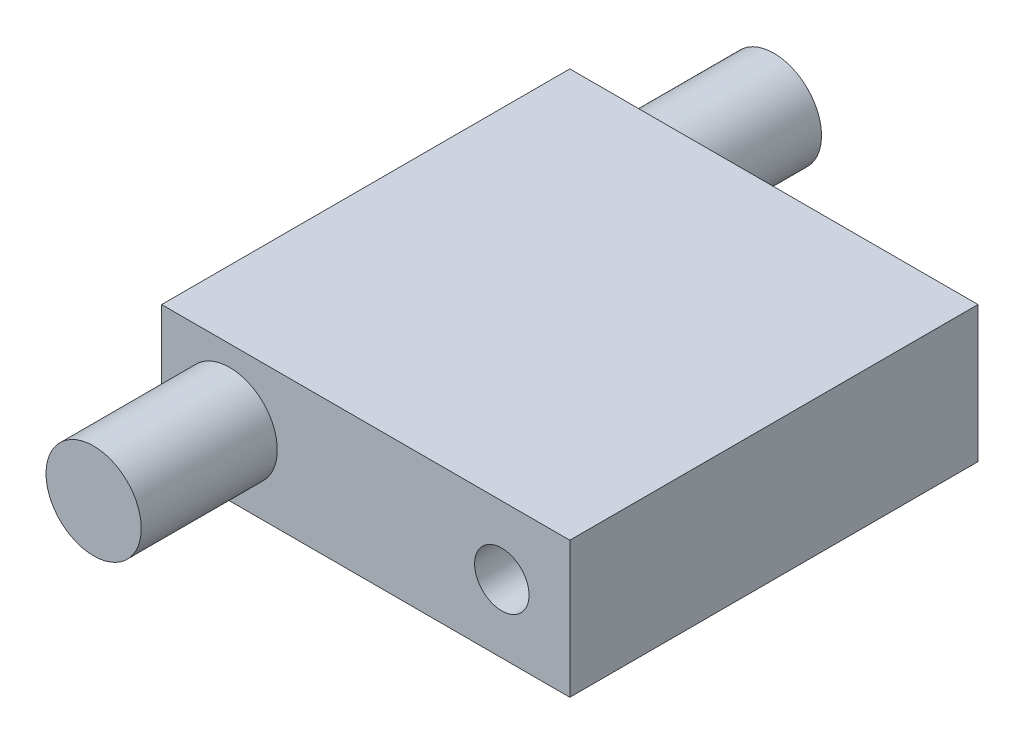
ISO-10303-21;
HEADER;
FILE_DESCRIPTION(('STEP AP214'),'2;1');
FILE_NAME('part.step','',(''),(''),'','','');
FILE_SCHEMA(('AUTOMOTIVE_DESIGN { 1 0 10303 214 1 1 1 1 }'));
ENDSEC;
DATA;
#1=APPLICATION_CONTEXT('core data for automotive mechanical design processes');
#2=APPLICATION_PROTOCOL_DEFINITION('international standard','automotive_design',2000,#1);
#3=PRODUCT_CONTEXT('',#1,'mechanical');
#4=PRODUCT('Part','Part','',(#3));
#5=PRODUCT_RELATED_PRODUCT_CATEGORY('part','',(#4));
#6=PRODUCT_DEFINITION_FORMATION('','',#4);
#7=PRODUCT_DEFINITION_CONTEXT('part definition',#1,'design');
#8=PRODUCT_DEFINITION('design','',#6,#7);
#9=PRODUCT_DEFINITION_SHAPE('','',#8);
#10=(LENGTH_UNIT() NAMED_UNIT(*) SI_UNIT(.MILLI.,.METRE.));
#11=(NAMED_UNIT(*) PLANE_ANGLE_UNIT() SI_UNIT($,.RADIAN.));
#12=(NAMED_UNIT(*) SI_UNIT($,.STERADIAN.) SOLID_ANGLE_UNIT());
#13=UNCERTAINTY_MEASURE_WITH_UNIT(LENGTH_MEASURE(1.E-05),#10,'distance_accuracy_value','');
#14=(GEOMETRIC_REPRESENTATION_CONTEXT(3) GLOBAL_UNCERTAINTY_ASSIGNED_CONTEXT((#13)) GLOBAL_UNIT_ASSIGNED_CONTEXT((#10,
#11,#12)) REPRESENTATION_CONTEXT('',''));
#15=CARTESIAN_POINT('',(0.,0.,0.));
#16=DIRECTION('',(0.,0.,1.));
#17=DIRECTION('',(1.,0.,0.));
#18=AXIS2_PLACEMENT_3D('',#15,#16,#17);
#19=CARTESIAN_POINT('',(300.,-100.,600.));
#20=DIRECTION('',(-1.,0.,0.));
#21=DIRECTION('',(0.,0.,1.));
#22=AXIS2_PLACEMENT_3D('',#19,#20,#21);
#23=PLANE('',#22);
#24=DIRECTION('',(0.,1.,0.));
#25=VECTOR('',#24,1.);
#26=CARTESIAN_POINT('',(300.,-100.,0.));
#27=LINE('',#26,#25);
#28=CARTESIAN_POINT('',(300.,-100.,0.));
#29=VERTEX_POINT('',#28);
#30=CARTESIAN_POINT('',(300.,100.,0.));
#31=VERTEX_POINT('',#30);
#32=EDGE_CURVE('E98',#29,#31,#27,.T.);
#33=ORIENTED_EDGE('',*,*,#32,.T.);
#34=DIRECTION('',(0.,0.,-1.));
#35=VECTOR('',#34,1.);
#36=CARTESIAN_POINT('',(300.,100.,600.));
#37=LINE('',#36,#35);
#38=CARTESIAN_POINT('',(300.,100.,600.));
#39=VERTEX_POINT('',#38);
#40=EDGE_CURVE('E40',#39,#31,#37,.T.);
#41=ORIENTED_EDGE('',*,*,#40,.F.);
#42=DIRECTION('',(0.,1.,0.));
#43=VECTOR('',#42,1.);
#44=CARTESIAN_POINT('',(300.,-100.,600.));
#45=LINE('',#44,#43);
#46=CARTESIAN_POINT('',(300.,-100.,600.));
#47=VERTEX_POINT('',#46);
#48=EDGE_CURVE('E84',#47,#39,#45,.T.);
#49=ORIENTED_EDGE('',*,*,#48,.F.);
#50=DIRECTION('',(0.,0.,-1.));
#51=VECTOR('',#50,1.);
#52=CARTESIAN_POINT('',(300.,-100.,600.));
#53=LINE('',#52,#51);
#54=EDGE_CURVE('E94',#47,#29,#53,.T.);
#55=ORIENTED_EDGE('',*,*,#54,.T.);
#56=EDGE_LOOP('',(#33,#41,#49,#55));
#57=FACE_BOUND('',#56,.T.);
#58=ADVANCED_FACE('F32',(#57),#23,.F.);
#59=CARTESIAN_POINT('',(-300.,100.,600.));
#60=DIRECTION('',(0.,-1.,0.));
#61=DIRECTION('',(0.,0.,-1.));
#62=AXIS2_PLACEMENT_3D('',#59,#60,#61);
#63=PLANE('',#62);
#64=DIRECTION('',(-1.,0.,0.));
#65=VECTOR('',#64,1.);
#66=CARTESIAN_POINT('',(-300.,100.,0.));
#67=LINE('',#66,#65);
#68=CARTESIAN_POINT('',(-300.,100.,0.));
#69=VERTEX_POINT('',#68);
#70=EDGE_CURVE('E89',#31,#69,#67,.T.);
#71=ORIENTED_EDGE('',*,*,#70,.T.);
#72=DIRECTION('',(0.,0.,-1.));
#73=VECTOR('',#72,1.);
#74=CARTESIAN_POINT('',(-300.,100.,600.));
#75=LINE('',#74,#73);
#76=CARTESIAN_POINT('',(-300.,100.,600.));
#77=VERTEX_POINT('',#76);
#78=EDGE_CURVE('E87',#77,#69,#75,.T.);
#79=ORIENTED_EDGE('',*,*,#78,.F.);
#80=DIRECTION('',(-1.,0.,0.));
#81=VECTOR('',#80,1.);
#82=CARTESIAN_POINT('',(-300.,100.,600.));
#83=LINE('',#82,#81);
#84=EDGE_CURVE('E79',#39,#77,#83,.T.);
#85=ORIENTED_EDGE('',*,*,#84,.F.);
#86=ORIENTED_EDGE('',*,*,#40,.T.);
#87=EDGE_LOOP('',(#71,#79,#85,#86));
#88=FACE_BOUND('',#87,.T.);
#89=ADVANCED_FACE('F88',(#88),#63,.F.);
#90=CARTESIAN_POINT('',(-300.,-100.,600.));
#91=DIRECTION('',(1.,0.,0.));
#92=DIRECTION('',(0.,0.,-1.));
#93=AXIS2_PLACEMENT_3D('',#90,#91,#92);
#94=PLANE('',#93);
#95=DIRECTION('',(0.,-1.,0.));
#96=VECTOR('',#95,1.);
#97=CARTESIAN_POINT('',(-300.,-100.,0.));
#98=LINE('',#97,#96);
#99=CARTESIAN_POINT('',(-300.,-100.,0.));
#100=VERTEX_POINT('',#99);
#101=EDGE_CURVE('E65',#69,#100,#98,.T.);
#102=ORIENTED_EDGE('',*,*,#101,.T.);
#103=DIRECTION('',(0.,0.,-1.));
#104=VECTOR('',#103,1.);
#105=CARTESIAN_POINT('',(-300.,-100.,600.));
#106=LINE('',#105,#104);
#107=CARTESIAN_POINT('',(-300.,-100.,600.));
#108=VERTEX_POINT('',#107);
#109=EDGE_CURVE('E90',#108,#100,#106,.T.);
#110=ORIENTED_EDGE('',*,*,#109,.F.);
#111=DIRECTION('',(0.,-1.,0.));
#112=VECTOR('',#111,1.);
#113=CARTESIAN_POINT('',(-300.,-100.,600.));
#114=LINE('',#113,#112);
#115=EDGE_CURVE('E82',#77,#108,#114,.T.);
#116=ORIENTED_EDGE('',*,*,#115,.F.);
#117=ORIENTED_EDGE('',*,*,#78,.T.);
#118=EDGE_LOOP('',(#102,#110,#116,#117));
#119=FACE_BOUND('',#118,.T.);
#120=ADVANCED_FACE('F92',(#119),#94,.F.);
#121=CARTESIAN_POINT('',(-300.,-100.,600.));
#122=DIRECTION('',(0.,1.,0.));
#123=DIRECTION('',(0.,0.,1.));
#124=AXIS2_PLACEMENT_3D('',#121,#122,#123);
#125=PLANE('',#124);
#126=DIRECTION('',(1.,0.,0.));
#127=VECTOR('',#126,1.);
#128=CARTESIAN_POINT('',(-300.,-100.,0.));
#129=LINE('',#128,#127);
#130=EDGE_CURVE('E71',#100,#29,#129,.T.);
#131=ORIENTED_EDGE('',*,*,#130,.T.);
#132=ORIENTED_EDGE('',*,*,#54,.F.);
#133=DIRECTION('',(1.,0.,0.));
#134=VECTOR('',#133,1.);
#135=CARTESIAN_POINT('',(-300.,-100.,600.));
#136=LINE('',#135,#134);
#137=EDGE_CURVE('E48',#108,#47,#136,.T.);
#138=ORIENTED_EDGE('',*,*,#137,.F.);
#139=ORIENTED_EDGE('',*,*,#109,.T.);
#140=EDGE_LOOP('',(#131,#132,#138,#139));
#141=FACE_BOUND('',#140,.T.);
#142=ADVANCED_FACE('F121',(#141),#125,.F.);
#143=CARTESIAN_POINT('',(0.,0.,600.));
#144=DIRECTION('',(0.,0.,-1.));
#145=DIRECTION('',(-1.,0.,0.));
#146=AXIS2_PLACEMENT_3D('',#143,#144,#145);
#147=PLANE('',#146);
#148=CARTESIAN_POINT('',(-200.,0.,600.));
#149=DIRECTION('',(0.,0.,-1.));
#150=DIRECTION('',(-1.,0.,0.));
#151=AXIS2_PLACEMENT_3D('',#148,#149,#150);
#152=CIRCLE('',#151,70.);
#153=CARTESIAN_POINT('',(-270.,0.,600.));
#154=VERTEX_POINT('',#153);
#155=EDGE_CURVE('E11',#154,#154,#152,.F.);
#156=ORIENTED_EDGE('',*,*,#155,.F.);
#157=EDGE_LOOP('',(#156));
#158=FACE_BOUND('',#157,.T.);
#159=CARTESIAN_POINT('',(200.,0.,600.));
#160=DIRECTION('',(0.,0.,-1.));
#161=DIRECTION('',(-1.,0.,0.));
#162=AXIS2_PLACEMENT_3D('',#159,#160,#161);
#163=CIRCLE('',#162,40.);
#164=CARTESIAN_POINT('',(160.,0.,600.));
#165=VERTEX_POINT('',#164);
#166=EDGE_CURVE('E101',#165,#165,#163,.F.);
#167=ORIENTED_EDGE('',*,*,#166,.F.);
#168=EDGE_LOOP('',(#167));
#169=FACE_BOUND('',#168,.T.);
#170=ORIENTED_EDGE('',*,*,#48,.T.);
#171=ORIENTED_EDGE('',*,*,#84,.T.);
#172=ORIENTED_EDGE('',*,*,#115,.T.);
#173=ORIENTED_EDGE('',*,*,#137,.T.);
#174=EDGE_LOOP('',(#170,#171,#172,#173));
#175=FACE_BOUND('',#174,.T.);
#176=ADVANCED_FACE('F80',(#158,#169,#175),#147,.F.);
#177=CARTESIAN_POINT('',(0.,0.,0.));
#178=DIRECTION('',(0.,0.,-1.));
#179=DIRECTION('',(-1.,0.,0.));
#180=AXIS2_PLACEMENT_3D('',#177,#178,#179);
#181=PLANE('',#180);
#182=CARTESIAN_POINT('',(-200.,0.,0.));
#183=DIRECTION('',(0.,0.,-1.));
#184=DIRECTION('',(-1.,0.,0.));
#185=AXIS2_PLACEMENT_3D('',#182,#183,#184);
#186=CIRCLE('',#185,70.);
#187=CARTESIAN_POINT('',(-270.,0.,0.));
#188=VERTEX_POINT('',#187);
#189=EDGE_CURVE('E198',#188,#188,#186,.T.);
#190=ORIENTED_EDGE('',*,*,#189,.F.);
#191=EDGE_LOOP('',(#190));
#192=FACE_BOUND('',#191,.T.);
#193=CARTESIAN_POINT('',(200.,0.,0.));
#194=DIRECTION('',(0.,0.,1.));
#195=DIRECTION('',(1.,0.,0.));
#196=AXIS2_PLACEMENT_3D('',#193,#194,#195);
#197=CIRCLE('',#196,40.);
#198=CARTESIAN_POINT('',(240.,0.,0.));
#199=VERTEX_POINT('',#198);
#200=EDGE_CURVE('E201',#199,#199,#197,.T.);
#201=ORIENTED_EDGE('',*,*,#200,.T.);
#202=EDGE_LOOP('',(#201));
#203=FACE_BOUND('',#202,.T.);
#204=ORIENTED_EDGE('',*,*,#32,.F.);
#205=ORIENTED_EDGE('',*,*,#130,.F.);
#206=ORIENTED_EDGE('',*,*,#101,.F.);
#207=ORIENTED_EDGE('',*,*,#70,.F.);
#208=EDGE_LOOP('',(#204,#205,#206,#207));
#209=FACE_BOUND('',#208,.T.);
#210=ADVANCED_FACE('F109',(#192,#203,#209),#181,.T.);
#211=CARTESIAN_POINT('',(200.,0.,640.));
#212=DIRECTION('',(0.,0.,-1.));
#213=DIRECTION('',(-1.,0.,0.));
#214=AXIS2_PLACEMENT_3D('',#211,#212,#213);
#215=CYLINDRICAL_SURFACE('',#214,40.);
#216=ORIENTED_EDGE('',*,*,#200,.F.);
#217=EDGE_LOOP('',(#216));
#218=FACE_BOUND('',#217,.T.);
#219=ORIENTED_EDGE('',*,*,#166,.T.);
#220=EDGE_LOOP('',(#219));
#221=FACE_BOUND('',#220,.T.);
#222=ADVANCED_FACE('F111',(#218,#221),#215,.F.);
#223=CARTESIAN_POINT('',(-200.,0.,800.));
#224=DIRECTION('',(0.,0.,-1.));
#225=DIRECTION('',(-1.,0.,0.));
#226=AXIS2_PLACEMENT_3D('',#223,#224,#225);
#227=CYLINDRICAL_SURFACE('',#226,70.);
#228=CARTESIAN_POINT('',(-200.,0.,800.));
#229=DIRECTION('',(0.,0.,1.));
#230=DIRECTION('',(1.,0.,0.));
#231=AXIS2_PLACEMENT_3D('',#228,#229,#230);
#232=CIRCLE('',#231,70.);
#233=CARTESIAN_POINT('',(-130.,0.,800.));
#234=VERTEX_POINT('',#233);
#235=EDGE_CURVE('E197',#234,#234,#232,.T.);
#236=ORIENTED_EDGE('',*,*,#235,.F.);
#237=EDGE_LOOP('',(#236));
#238=FACE_BOUND('',#237,.T.);
#239=ORIENTED_EDGE('',*,*,#155,.T.);
#240=EDGE_LOOP('',(#239));
#241=FACE_BOUND('',#240,.T.);
#242=ADVANCED_FACE('F118',(#238,#241),#227,.T.);
#243=CARTESIAN_POINT('',(-200.,0.,800.));
#244=DIRECTION('',(0.,0.,1.));
#245=DIRECTION('',(1.,0.,0.));
#246=AXIS2_PLACEMENT_3D('',#243,#244,#245);
#247=PLANE('',#246);
#248=ORIENTED_EDGE('',*,*,#235,.T.);
#249=EDGE_LOOP('',(#248));
#250=FACE_BOUND('',#249,.T.);
#251=ADVANCED_FACE('F157',(#250),#247,.T.);
#252=CARTESIAN_POINT('',(-200.,0.,-200.));
#253=DIRECTION('',(0.,0.,1.));
#254=DIRECTION('',(1.,0.,0.));
#255=AXIS2_PLACEMENT_3D('',#252,#253,#254);
#256=CYLINDRICAL_SURFACE('',#255,70.);
#257=CARTESIAN_POINT('',(-200.,0.,-200.));
#258=DIRECTION('',(0.,0.,-1.));
#259=DIRECTION('',(-1.,0.,0.));
#260=AXIS2_PLACEMENT_3D('',#257,#258,#259);
#261=CIRCLE('',#260,70.);
#262=CARTESIAN_POINT('',(-270.,0.,-200.));
#263=VERTEX_POINT('',#262);
#264=EDGE_CURVE('E196',#263,#263,#261,.T.);
#265=ORIENTED_EDGE('',*,*,#264,.F.);
#266=EDGE_LOOP('',(#265));
#267=FACE_BOUND('',#266,.T.);
#268=ORIENTED_EDGE('',*,*,#189,.T.);
#269=EDGE_LOOP('',(#268));
#270=FACE_BOUND('',#269,.T.);
#271=ADVANCED_FACE('F166',(#267,#270),#256,.T.);
#272=CARTESIAN_POINT('',(-200.,0.,-200.));
#273=DIRECTION('',(0.,0.,-1.));
#274=DIRECTION('',(-1.,0.,0.));
#275=AXIS2_PLACEMENT_3D('',#272,#273,#274);
#276=PLANE('',#275);
#277=ORIENTED_EDGE('',*,*,#264,.T.);
#278=EDGE_LOOP('',(#277));
#279=FACE_BOUND('',#278,.T.);
#280=ADVANCED_FACE('F180',(#279),#276,.T.);
#281=CLOSED_SHELL('',(#58,#89,#120,#142,#176,#210,#222,#242,#251,#271,#280));
#282=MANIFOLD_SOLID_BREP('B2',#281);
#283=ADVANCED_BREP_SHAPE_REPRESENTATION('',(#18,#282),#14);
#284=SHAPE_DEFINITION_REPRESENTATION(#9,#283);
ENDSEC;
END-ISO-10303-21;
